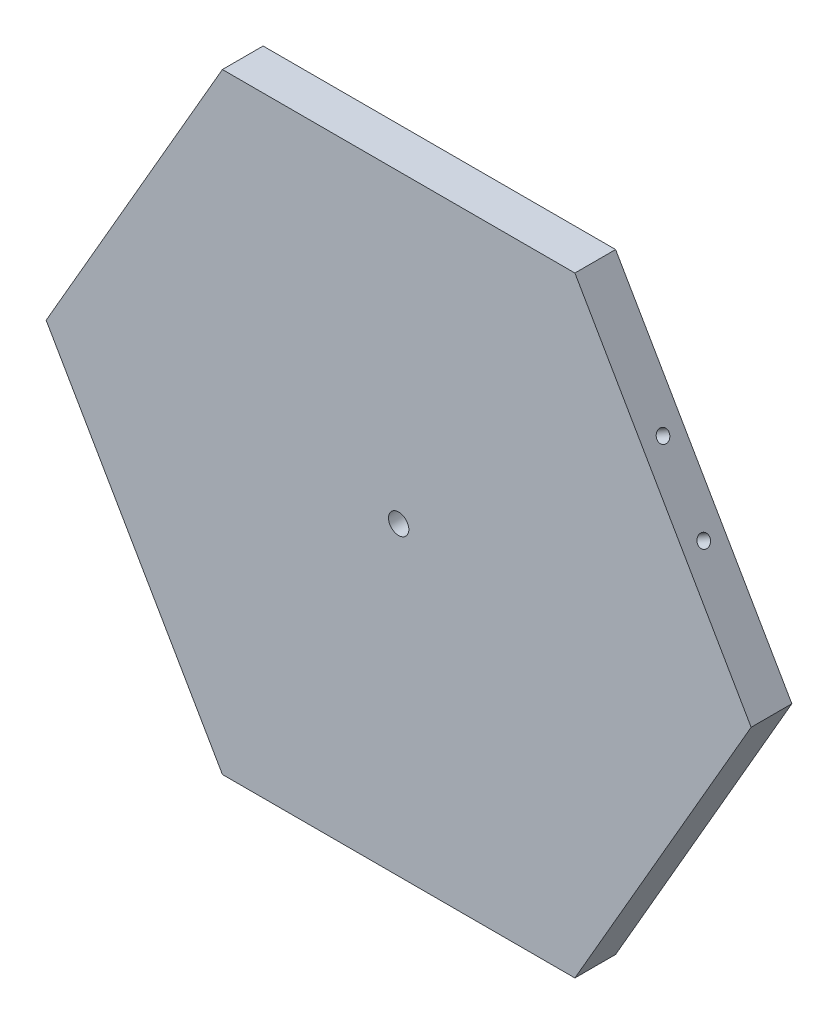
ISO-10303-21;
HEADER;
FILE_DESCRIPTION(('STEP AP214'),'2;1');
FILE_NAME('part.step','',(''),(''),'','','');
FILE_SCHEMA(('AUTOMOTIVE_DESIGN { 1 0 10303 214 1 1 1 1 }'));
ENDSEC;
DATA;
#1=APPLICATION_CONTEXT('core data for automotive mechanical design processes');
#2=APPLICATION_PROTOCOL_DEFINITION('international standard','automotive_design',2000,#1);
#3=PRODUCT_CONTEXT('',#1,'mechanical');
#4=PRODUCT('Part','Part','',(#3));
#5=PRODUCT_RELATED_PRODUCT_CATEGORY('part','',(#4));
#6=PRODUCT_DEFINITION_FORMATION('','',#4);
#7=PRODUCT_DEFINITION_CONTEXT('part definition',#1,'design');
#8=PRODUCT_DEFINITION('design','',#6,#7);
#9=PRODUCT_DEFINITION_SHAPE('','',#8);
#10=(LENGTH_UNIT() NAMED_UNIT(*) SI_UNIT(.MILLI.,.METRE.));
#11=(NAMED_UNIT(*) PLANE_ANGLE_UNIT() SI_UNIT($,.RADIAN.));
#12=(NAMED_UNIT(*) SI_UNIT($,.STERADIAN.) SOLID_ANGLE_UNIT());
#13=UNCERTAINTY_MEASURE_WITH_UNIT(LENGTH_MEASURE(1.E-05),#10,'distance_accuracy_value','');
#14=(GEOMETRIC_REPRESENTATION_CONTEXT(3) GLOBAL_UNCERTAINTY_ASSIGNED_CONTEXT((#13)) GLOBAL_UNIT_ASSIGNED_CONTEXT((#10,
#11,#12)) REPRESENTATION_CONTEXT('',''));
#15=CARTESIAN_POINT('',(0.,0.,0.));
#16=DIRECTION('',(0.,0.,1.));
#17=DIRECTION('',(1.,0.,0.));
#18=AXIS2_PLACEMENT_3D('',#15,#16,#17);
#19=CARTESIAN_POINT('',(43.3012701892219,-75.,5.));
#20=DIRECTION('',(-0.866025403784439,0.5,0.));
#21=DIRECTION('',(-0.5,-0.866025403784439,0.));
#22=AXIS2_PLACEMENT_3D('',#19,#20,#21);
#23=PLANE('',#22);
#24=DIRECTION('',(0.5,0.866025403784439,0.));
#25=VECTOR('',#24,1.);
#26=CARTESIAN_POINT('',(43.3012701892219,-75.,-5.));
#27=LINE('',#26,#25);
#28=CARTESIAN_POINT('',(43.3012701892219,-75.,-5.));
#29=VERTEX_POINT('',#28);
#30=CARTESIAN_POINT('',(86.6025403784438,0.,-5.));
#31=VERTEX_POINT('',#30);
#32=EDGE_CURVE('E138',#29,#31,#27,.T.);
#33=ORIENTED_EDGE('',*,*,#32,.T.);
#34=DIRECTION('',(0.,0.,-1.));
#35=VECTOR('',#34,1.);
#36=CARTESIAN_POINT('',(86.6025403784438,0.,5.));
#37=LINE('',#36,#35);
#38=CARTESIAN_POINT('',(86.6025403784438,0.,5.));
#39=VERTEX_POINT('',#38);
#40=EDGE_CURVE('E11',#39,#31,#37,.T.);
#41=ORIENTED_EDGE('',*,*,#40,.F.);
#42=DIRECTION('',(0.5,0.866025403784439,0.));
#43=VECTOR('',#42,1.);
#44=CARTESIAN_POINT('',(43.3012701892219,-75.,5.));
#45=LINE('',#44,#43);
#46=CARTESIAN_POINT('',(43.3012701892219,-75.,5.));
#47=VERTEX_POINT('',#46);
#48=EDGE_CURVE('E154',#47,#39,#45,.T.);
#49=ORIENTED_EDGE('',*,*,#48,.F.);
#50=DIRECTION('',(0.,0.,-1.));
#51=VECTOR('',#50,1.);
#52=CARTESIAN_POINT('',(43.3012701892219,-75.,5.));
#53=LINE('',#52,#51);
#54=EDGE_CURVE('E134',#47,#29,#53,.T.);
#55=ORIENTED_EDGE('',*,*,#54,.T.);
#56=EDGE_LOOP('',(#33,#41,#49,#55));
#57=FACE_BOUND('',#56,.T.);
#58=ADVANCED_FACE('F46',(#57),#23,.F.);
#59=CARTESIAN_POINT('',(86.6025403784438,0.,5.));
#60=DIRECTION('',(-0.866025403784439,-0.5,0.));
#61=DIRECTION('',(0.5,-0.866025403784439,0.));
#62=AXIS2_PLACEMENT_3D('',#59,#60,#61);
#63=PLANE('',#62);
#64=CARTESIAN_POINT('',(59.9519052838333,46.1602540378438,0.));
#65=DIRECTION('',(0.866025403784443,0.499999999999992,0.));
#66=DIRECTION('',(0.,0.,-1.));
#67=AXIS2_PLACEMENT_3D('',#64,#65,#66);
#68=CIRCLE('',#67,1.5);
#69=CARTESIAN_POINT('',(59.9519052838333,46.1602540378438,-1.5));
#70=VERTEX_POINT('',#69);
#71=EDGE_CURVE('E267',#70,#70,#68,.T.);
#72=ORIENTED_EDGE('',*,*,#71,.F.);
#73=EDGE_LOOP('',(#72));
#74=FACE_BOUND('',#73,.T.);
#75=CARTESIAN_POINT('',(69.9519052838332,28.839745962155,0.));
#76=DIRECTION('',(0.866025403784443,0.499999999999992,0.));
#77=DIRECTION('',(0.,0.,-1.));
#78=AXIS2_PLACEMENT_3D('',#75,#76,#77);
#79=CIRCLE('',#78,1.5);
#80=CARTESIAN_POINT('',(69.9519052838332,28.839745962155,-1.5));
#81=VERTEX_POINT('',#80);
#82=EDGE_CURVE('E266',#81,#81,#79,.T.);
#83=ORIENTED_EDGE('',*,*,#82,.F.);
#84=EDGE_LOOP('',(#83));
#85=FACE_BOUND('',#84,.T.);
#86=DIRECTION('',(-0.5,0.866025403784438,0.));
#87=VECTOR('',#86,1.);
#88=CARTESIAN_POINT('',(86.6025403784438,0.,-5.));
#89=LINE('',#88,#87);
#90=CARTESIAN_POINT('',(43.3012701892219,75.,-5.));
#91=VERTEX_POINT('',#90);
#92=EDGE_CURVE('E142',#31,#91,#89,.T.);
#93=ORIENTED_EDGE('',*,*,#92,.T.);
#94=DIRECTION('',(0.,0.,-1.));
#95=VECTOR('',#94,1.);
#96=CARTESIAN_POINT('',(43.3012701892219,75.,5.));
#97=LINE('',#96,#95);
#98=CARTESIAN_POINT('',(43.3012701892219,75.,5.));
#99=VERTEX_POINT('',#98);
#100=EDGE_CURVE('E55',#99,#91,#97,.T.);
#101=ORIENTED_EDGE('',*,*,#100,.F.);
#102=DIRECTION('',(-0.5,0.866025403784438,0.));
#103=VECTOR('',#102,1.);
#104=CARTESIAN_POINT('',(86.6025403784438,0.,5.));
#105=LINE('',#104,#103);
#106=EDGE_CURVE('E100',#39,#99,#105,.T.);
#107=ORIENTED_EDGE('',*,*,#106,.F.);
#108=ORIENTED_EDGE('',*,*,#40,.T.);
#109=EDGE_LOOP('',(#93,#101,#107,#108));
#110=FACE_BOUND('',#109,.T.);
#111=ADVANCED_FACE('F187',(#74,#85,#110),#63,.F.);
#112=CARTESIAN_POINT('',(43.3012701892219,75.,5.));
#113=DIRECTION('',(0.,-1.,0.));
#114=DIRECTION('',(0.,0.,-1.));
#115=AXIS2_PLACEMENT_3D('',#112,#113,#114);
#116=PLANE('',#115);
#117=DIRECTION('',(-1.,0.,0.));
#118=VECTOR('',#117,1.);
#119=CARTESIAN_POINT('',(43.3012701892219,75.,-5.));
#120=LINE('',#119,#118);
#121=CARTESIAN_POINT('',(-43.3012701892219,75.,-5.));
#122=VERTEX_POINT('',#121);
#123=EDGE_CURVE('E145',#91,#122,#120,.T.);
#124=ORIENTED_EDGE('',*,*,#123,.T.);
#125=DIRECTION('',(0.,0.,-1.));
#126=VECTOR('',#125,1.);
#127=CARTESIAN_POINT('',(-43.3012701892219,75.,5.));
#128=LINE('',#127,#126);
#129=CARTESIAN_POINT('',(-43.3012701892219,75.,5.));
#130=VERTEX_POINT('',#129);
#131=EDGE_CURVE('E124',#130,#122,#128,.T.);
#132=ORIENTED_EDGE('',*,*,#131,.F.);
#133=DIRECTION('',(-1.,0.,0.));
#134=VECTOR('',#133,1.);
#135=CARTESIAN_POINT('',(43.3012701892219,75.,5.));
#136=LINE('',#135,#134);
#137=EDGE_CURVE('E113',#99,#130,#136,.T.);
#138=ORIENTED_EDGE('',*,*,#137,.F.);
#139=ORIENTED_EDGE('',*,*,#100,.T.);
#140=EDGE_LOOP('',(#124,#132,#138,#139));
#141=FACE_BOUND('',#140,.T.);
#142=ADVANCED_FACE('F165',(#141),#116,.F.);
#143=CARTESIAN_POINT('',(-43.3012701892219,75.,5.));
#144=DIRECTION('',(0.866025403784439,-0.5,0.));
#145=DIRECTION('',(0.5,0.866025403784439,0.));
#146=AXIS2_PLACEMENT_3D('',#143,#144,#145);
#147=PLANE('',#146);
#148=CARTESIAN_POINT('',(-69.9519052838328,28.8397459621559,0.));
#149=DIRECTION('',(-0.866025403784436,0.500000000000004,0.));
#150=DIRECTION('',(0.,0.,-1.));
#151=AXIS2_PLACEMENT_3D('',#148,#149,#150);
#152=CIRCLE('',#151,1.5);
#153=CARTESIAN_POINT('',(-69.9519052838328,28.8397459621559,-1.5));
#154=VERTEX_POINT('',#153);
#155=EDGE_CURVE('E206',#154,#154,#152,.T.);
#156=ORIENTED_EDGE('',*,*,#155,.F.);
#157=EDGE_LOOP('',(#156));
#158=FACE_BOUND('',#157,.T.);
#159=CARTESIAN_POINT('',(-59.9519052838327,46.1602540378447,0.));
#160=DIRECTION('',(-0.866025403784436,0.500000000000004,0.));
#161=DIRECTION('',(0.,0.,-1.));
#162=AXIS2_PLACEMENT_3D('',#159,#160,#161);
#163=CIRCLE('',#162,1.5);
#164=CARTESIAN_POINT('',(-59.9519052838327,46.1602540378447,-1.5));
#165=VERTEX_POINT('',#164);
#166=EDGE_CURVE('E209',#165,#165,#163,.T.);
#167=ORIENTED_EDGE('',*,*,#166,.F.);
#168=EDGE_LOOP('',(#167));
#169=FACE_BOUND('',#168,.T.);
#170=DIRECTION('',(-0.5,-0.866025403784439,0.));
#171=VECTOR('',#170,1.);
#172=CARTESIAN_POINT('',(-43.3012701892219,75.,-5.));
#173=LINE('',#172,#171);
#174=CARTESIAN_POINT('',(-86.6025403784439,0.,-5.));
#175=VERTEX_POINT('',#174);
#176=EDGE_CURVE('E122',#122,#175,#173,.T.);
#177=ORIENTED_EDGE('',*,*,#176,.T.);
#178=DIRECTION('',(0.,0.,-1.));
#179=VECTOR('',#178,1.);
#180=CARTESIAN_POINT('',(-86.6025403784439,0.,5.));
#181=LINE('',#180,#179);
#182=CARTESIAN_POINT('',(-86.6025403784439,0.,5.));
#183=VERTEX_POINT('',#182);
#184=EDGE_CURVE('E119',#183,#175,#181,.T.);
#185=ORIENTED_EDGE('',*,*,#184,.F.);
#186=DIRECTION('',(-0.5,-0.866025403784439,0.));
#187=VECTOR('',#186,1.);
#188=CARTESIAN_POINT('',(-43.3012701892219,75.,5.));
#189=LINE('',#188,#187);
#190=EDGE_CURVE('E107',#130,#183,#189,.T.);
#191=ORIENTED_EDGE('',*,*,#190,.F.);
#192=ORIENTED_EDGE('',*,*,#131,.T.);
#193=EDGE_LOOP('',(#177,#185,#191,#192));
#194=FACE_BOUND('',#193,.T.);
#195=ADVANCED_FACE('F120',(#158,#169,#194),#147,.F.);
#196=CARTESIAN_POINT('',(-86.6025403784439,0.,5.));
#197=DIRECTION('',(0.866025403784439,0.5,0.));
#198=DIRECTION('',(-0.5,0.866025403784439,0.));
#199=AXIS2_PLACEMENT_3D('',#196,#197,#198);
#200=PLANE('',#199);
#201=DIRECTION('',(0.5,-0.866025403784439,0.));
#202=VECTOR('',#201,1.);
#203=CARTESIAN_POINT('',(-86.6025403784439,0.,-5.));
#204=LINE('',#203,#202);
#205=CARTESIAN_POINT('',(-43.3012701892219,-75.,-5.));
#206=VERTEX_POINT('',#205);
#207=EDGE_CURVE('E86',#175,#206,#204,.T.);
#208=ORIENTED_EDGE('',*,*,#207,.T.);
#209=DIRECTION('',(0.,0.,-1.));
#210=VECTOR('',#209,1.);
#211=CARTESIAN_POINT('',(-43.3012701892219,-75.,5.));
#212=LINE('',#211,#210);
#213=CARTESIAN_POINT('',(-43.3012701892219,-75.,5.));
#214=VERTEX_POINT('',#213);
#215=EDGE_CURVE('E125',#214,#206,#212,.T.);
#216=ORIENTED_EDGE('',*,*,#215,.F.);
#217=DIRECTION('',(0.5,-0.866025403784439,0.));
#218=VECTOR('',#217,1.);
#219=CARTESIAN_POINT('',(-86.6025403784439,0.,5.));
#220=LINE('',#219,#218);
#221=EDGE_CURVE('E111',#183,#214,#220,.T.);
#222=ORIENTED_EDGE('',*,*,#221,.F.);
#223=ORIENTED_EDGE('',*,*,#184,.T.);
#224=EDGE_LOOP('',(#208,#216,#222,#223));
#225=FACE_BOUND('',#224,.T.);
#226=ADVANCED_FACE('F127',(#225),#200,.F.);
#227=CARTESIAN_POINT('',(-43.3012701892219,-75.,5.));
#228=DIRECTION('',(0.,1.,0.));
#229=DIRECTION('',(0.,0.,1.));
#230=AXIS2_PLACEMENT_3D('',#227,#228,#229);
#231=PLANE('',#230);
#232=CARTESIAN_POINT('',(-10.,-75.,0.));
#233=DIRECTION('',(0.,-1.,0.));
#234=DIRECTION('',(0.,0.,-1.));
#235=AXIS2_PLACEMENT_3D('',#232,#233,#234);
#236=CIRCLE('',#235,1.5);
#237=CARTESIAN_POINT('',(-10.,-75.,-1.5));
#238=VERTEX_POINT('',#237);
#239=EDGE_CURVE('E237',#238,#238,#236,.T.);
#240=ORIENTED_EDGE('',*,*,#239,.F.);
#241=EDGE_LOOP('',(#240));
#242=FACE_BOUND('',#241,.T.);
#243=CARTESIAN_POINT('',(10.,-75.,0.));
#244=DIRECTION('',(0.,-1.,0.));
#245=DIRECTION('',(0.,0.,-1.));
#246=AXIS2_PLACEMENT_3D('',#243,#244,#245);
#247=CIRCLE('',#246,1.5);
#248=CARTESIAN_POINT('',(10.,-75.,-1.5));
#249=VERTEX_POINT('',#248);
#250=EDGE_CURVE('E241',#249,#249,#247,.T.);
#251=ORIENTED_EDGE('',*,*,#250,.F.);
#252=EDGE_LOOP('',(#251));
#253=FACE_BOUND('',#252,.T.);
#254=DIRECTION('',(1.,0.,0.));
#255=VECTOR('',#254,1.);
#256=CARTESIAN_POINT('',(-43.3012701892219,-75.,-5.));
#257=LINE('',#256,#255);
#258=EDGE_CURVE('E92',#206,#29,#257,.T.);
#259=ORIENTED_EDGE('',*,*,#258,.T.);
#260=ORIENTED_EDGE('',*,*,#54,.F.);
#261=DIRECTION('',(1.,0.,0.));
#262=VECTOR('',#261,1.);
#263=CARTESIAN_POINT('',(-43.3012701892219,-75.,5.));
#264=LINE('',#263,#262);
#265=EDGE_CURVE('E63',#214,#47,#264,.T.);
#266=ORIENTED_EDGE('',*,*,#265,.F.);
#267=ORIENTED_EDGE('',*,*,#215,.T.);
#268=EDGE_LOOP('',(#259,#260,#266,#267));
#269=FACE_BOUND('',#268,.T.);
#270=ADVANCED_FACE('F172',(#242,#253,#269),#231,.F.);
#271=CARTESIAN_POINT('',(0.,0.,5.));
#272=DIRECTION('',(0.,0.,1.));
#273=DIRECTION('',(1.,0.,0.));
#274=AXIS2_PLACEMENT_3D('',#271,#272,#273);
#275=PLANE('',#274);
#276=CARTESIAN_POINT('',(0.,0.,5.));
#277=DIRECTION('',(0.,0.,1.));
#278=DIRECTION('',(1.,0.,0.));
#279=AXIS2_PLACEMENT_3D('',#276,#277,#278);
#280=CIRCLE('',#279,2.5);
#281=CARTESIAN_POINT('',(2.5,0.,5.));
#282=VERTEX_POINT('',#281);
#283=EDGE_CURVE('E220',#282,#282,#280,.T.);
#284=ORIENTED_EDGE('',*,*,#283,.F.);
#285=EDGE_LOOP('',(#284));
#286=FACE_BOUND('',#285,.T.);
#287=ORIENTED_EDGE('',*,*,#48,.T.);
#288=ORIENTED_EDGE('',*,*,#106,.T.);
#289=ORIENTED_EDGE('',*,*,#137,.T.);
#290=ORIENTED_EDGE('',*,*,#190,.T.);
#291=ORIENTED_EDGE('',*,*,#221,.T.);
#292=ORIENTED_EDGE('',*,*,#265,.T.);
#293=EDGE_LOOP('',(#287,#288,#289,#290,#291,#292));
#294=FACE_BOUND('',#293,.T.);
#295=ADVANCED_FACE('F109',(#286,#294),#275,.T.);
#296=CARTESIAN_POINT('',(0.,0.,-5.));
#297=DIRECTION('',(0.,0.,1.));
#298=DIRECTION('',(1.,0.,0.));
#299=AXIS2_PLACEMENT_3D('',#296,#297,#298);
#300=PLANE('',#299);
#301=CARTESIAN_POINT('',(0.,0.,-5.));
#302=DIRECTION('',(0.,0.,1.));
#303=DIRECTION('',(1.,0.,0.));
#304=AXIS2_PLACEMENT_3D('',#301,#302,#303);
#305=CIRCLE('',#304,2.5);
#306=CARTESIAN_POINT('',(2.5,0.,-5.));
#307=VERTEX_POINT('',#306);
#308=EDGE_CURVE('E227',#307,#307,#305,.T.);
#309=ORIENTED_EDGE('',*,*,#308,.T.);
#310=EDGE_LOOP('',(#309));
#311=FACE_BOUND('',#310,.T.);
#312=ORIENTED_EDGE('',*,*,#32,.F.);
#313=ORIENTED_EDGE('',*,*,#258,.F.);
#314=ORIENTED_EDGE('',*,*,#207,.F.);
#315=ORIENTED_EDGE('',*,*,#176,.F.);
#316=ORIENTED_EDGE('',*,*,#123,.F.);
#317=ORIENTED_EDGE('',*,*,#92,.F.);
#318=EDGE_LOOP('',(#312,#313,#314,#315,#316,#317));
#319=FACE_BOUND('',#318,.T.);
#320=ADVANCED_FACE('F168',(#311,#319),#300,.F.);
#321=CARTESIAN_POINT('',(10.,-65.,0.));
#322=DIRECTION('',(0.,-1.,0.));
#323=DIRECTION('',(0.,0.,-1.));
#324=AXIS2_PLACEMENT_3D('',#321,#322,#323);
#325=CYLINDRICAL_SURFACE('',#324,1.5);
#326=CARTESIAN_POINT('',(10.,-65.,0.));
#327=DIRECTION('',(0.,-1.,0.));
#328=DIRECTION('',(0.,0.,-1.));
#329=AXIS2_PLACEMENT_3D('',#326,#327,#328);
#330=CIRCLE('',#329,1.5);
#331=CARTESIAN_POINT('',(10.,-65.,-1.5));
#332=VERTEX_POINT('',#331);
#333=EDGE_CURVE('E231',#332,#332,#330,.T.);
#334=ORIENTED_EDGE('',*,*,#333,.F.);
#335=EDGE_LOOP('',(#334));
#336=FACE_BOUND('',#335,.T.);
#337=ORIENTED_EDGE('',*,*,#250,.T.);
#338=EDGE_LOOP('',(#337));
#339=FACE_BOUND('',#338,.T.);
#340=ADVANCED_FACE('F336',(#336,#339),#325,.F.);
#341=CARTESIAN_POINT('',(10.,-65.,0.));
#342=DIRECTION('',(0.,-1.,0.));
#343=DIRECTION('',(0.,0.,-1.));
#344=AXIS2_PLACEMENT_3D('',#341,#342,#343);
#345=PLANE('',#344);
#346=ORIENTED_EDGE('',*,*,#333,.T.);
#347=EDGE_LOOP('',(#346));
#348=FACE_BOUND('',#347,.T.);
#349=ADVANCED_FACE('F334',(#348),#345,.T.);
#350=CARTESIAN_POINT('',(-10.,-65.,0.));
#351=DIRECTION('',(0.,-1.,0.));
#352=DIRECTION('',(0.,0.,-1.));
#353=AXIS2_PLACEMENT_3D('',#350,#351,#352);
#354=CYLINDRICAL_SURFACE('',#353,1.5);
#355=CARTESIAN_POINT('',(-10.,-65.,0.));
#356=DIRECTION('',(0.,-1.,0.));
#357=DIRECTION('',(0.,0.,-1.));
#358=AXIS2_PLACEMENT_3D('',#355,#356,#357);
#359=CIRCLE('',#358,1.5);
#360=CARTESIAN_POINT('',(-10.,-65.,-1.5));
#361=VERTEX_POINT('',#360);
#362=EDGE_CURVE('E143',#361,#361,#359,.T.);
#363=ORIENTED_EDGE('',*,*,#362,.F.);
#364=EDGE_LOOP('',(#363));
#365=FACE_BOUND('',#364,.T.);
#366=ORIENTED_EDGE('',*,*,#239,.T.);
#367=EDGE_LOOP('',(#366));
#368=FACE_BOUND('',#367,.T.);
#369=ADVANCED_FACE('F330',(#365,#368),#354,.F.);
#370=CARTESIAN_POINT('',(-10.,-65.,0.));
#371=DIRECTION('',(0.,-1.,0.));
#372=DIRECTION('',(0.,0.,-1.));
#373=AXIS2_PLACEMENT_3D('',#370,#371,#372);
#374=PLANE('',#373);
#375=ORIENTED_EDGE('',*,*,#362,.T.);
#376=EDGE_LOOP('',(#375));
#377=FACE_BOUND('',#376,.T.);
#378=ADVANCED_FACE('F326',(#377),#374,.T.);
#379=CARTESIAN_POINT('',(0.,0.,-5.));
#380=DIRECTION('',(0.,0.,1.));
#381=DIRECTION('',(1.,0.,0.));
#382=AXIS2_PLACEMENT_3D('',#379,#380,#381);
#383=CYLINDRICAL_SURFACE('',#382,2.5);
#384=ORIENTED_EDGE('',*,*,#308,.F.);
#385=EDGE_LOOP('',(#384));
#386=FACE_BOUND('',#385,.T.);
#387=ORIENTED_EDGE('',*,*,#283,.T.);
#388=EDGE_LOOP('',(#387));
#389=FACE_BOUND('',#388,.T.);
#390=ADVANCED_FACE('F322',(#386,#389),#383,.F.);
#391=CARTESIAN_POINT('',(-51.2916512459883,41.1602540378446,0.));
#392=DIRECTION('',(-0.866025403784436,0.500000000000004,0.));
#393=DIRECTION('',(-0.500000000000004,-0.866025403784436,0.));
#394=AXIS2_PLACEMENT_3D('',#391,#392,#393);
#395=CYLINDRICAL_SURFACE('',#394,1.5);
#396=CARTESIAN_POINT('',(-51.2916512459883,41.1602540378446,0.));
#397=DIRECTION('',(-0.866025403784436,0.500000000000004,0.));
#398=DIRECTION('',(0.,0.,-1.));
#399=AXIS2_PLACEMENT_3D('',#396,#397,#398);
#400=CIRCLE('',#399,1.5);
#401=CARTESIAN_POINT('',(-51.2916512459883,41.1602540378446,-1.5));
#402=VERTEX_POINT('',#401);
#403=EDGE_CURVE('E212',#402,#402,#400,.T.);
#404=ORIENTED_EDGE('',*,*,#403,.F.);
#405=EDGE_LOOP('',(#404));
#406=FACE_BOUND('',#405,.T.);
#407=ORIENTED_EDGE('',*,*,#166,.T.);
#408=EDGE_LOOP('',(#407));
#409=FACE_BOUND('',#408,.T.);
#410=ADVANCED_FACE('F318',(#406,#409),#395,.F.);
#411=CARTESIAN_POINT('',(-51.2916512459883,41.1602540378446,0.));
#412=DIRECTION('',(-0.866025403784436,0.500000000000004,0.));
#413=DIRECTION('',(0.,0.,-1.));
#414=AXIS2_PLACEMENT_3D('',#411,#412,#413);
#415=PLANE('',#414);
#416=ORIENTED_EDGE('',*,*,#403,.T.);
#417=EDGE_LOOP('',(#416));
#418=FACE_BOUND('',#417,.T.);
#419=ADVANCED_FACE('F314',(#418),#415,.T.);
#420=CARTESIAN_POINT('',(-61.2916512459884,23.8397459621559,0.));
#421=DIRECTION('',(-0.866025403784436,0.500000000000004,0.));
#422=DIRECTION('',(-0.500000000000004,-0.866025403784436,0.));
#423=AXIS2_PLACEMENT_3D('',#420,#421,#422);
#424=CYLINDRICAL_SURFACE('',#423,1.5);
#425=CARTESIAN_POINT('',(-61.2916512459884,23.8397459621559,0.));
#426=DIRECTION('',(-0.866025403784436,0.500000000000004,0.));
#427=DIRECTION('',(0.,0.,-1.));
#428=AXIS2_PLACEMENT_3D('',#425,#426,#427);
#429=CIRCLE('',#428,1.5);
#430=CARTESIAN_POINT('',(-61.2916512459884,23.8397459621559,-1.5));
#431=VERTEX_POINT('',#430);
#432=EDGE_CURVE('E213',#431,#431,#429,.T.);
#433=ORIENTED_EDGE('',*,*,#432,.F.);
#434=EDGE_LOOP('',(#433));
#435=FACE_BOUND('',#434,.T.);
#436=ORIENTED_EDGE('',*,*,#155,.T.);
#437=EDGE_LOOP('',(#436));
#438=FACE_BOUND('',#437,.T.);
#439=ADVANCED_FACE('F317',(#435,#438),#424,.F.);
#440=CARTESIAN_POINT('',(-61.2916512459884,23.8397459621559,0.));
#441=DIRECTION('',(-0.866025403784436,0.500000000000004,0.));
#442=DIRECTION('',(0.,0.,-1.));
#443=AXIS2_PLACEMENT_3D('',#440,#441,#442);
#444=PLANE('',#443);
#445=ORIENTED_EDGE('',*,*,#432,.T.);
#446=EDGE_LOOP('',(#445));
#447=FACE_BOUND('',#446,.T.);
#448=ADVANCED_FACE('F377',(#447),#444,.T.);
#449=CARTESIAN_POINT('',(61.2916512459887,23.839745962155,0.));
#450=DIRECTION('',(0.866025403784443,0.499999999999992,0.));
#451=DIRECTION('',(-0.499999999999992,0.866025403784443,0.));
#452=AXIS2_PLACEMENT_3D('',#449,#450,#451);
#453=CYLINDRICAL_SURFACE('',#452,1.5);
#454=CARTESIAN_POINT('',(61.2916512459887,23.839745962155,0.));
#455=DIRECTION('',(0.866025403784443,0.499999999999992,0.));
#456=DIRECTION('',(0.,0.,-1.));
#457=AXIS2_PLACEMENT_3D('',#454,#455,#456);
#458=CIRCLE('',#457,1.5);
#459=CARTESIAN_POINT('',(61.2916512459887,23.839745962155,-1.5));
#460=VERTEX_POINT('',#459);
#461=EDGE_CURVE('E286',#460,#460,#458,.T.);
#462=ORIENTED_EDGE('',*,*,#461,.F.);
#463=EDGE_LOOP('',(#462));
#464=FACE_BOUND('',#463,.T.);
#465=ORIENTED_EDGE('',*,*,#82,.T.);
#466=EDGE_LOOP('',(#465));
#467=FACE_BOUND('',#466,.T.);
#468=ADVANCED_FACE('F308',(#464,#467),#453,.F.);
#469=CARTESIAN_POINT('',(61.2916512459887,23.839745962155,0.));
#470=DIRECTION('',(0.866025403784443,0.499999999999992,0.));
#471=DIRECTION('',(0.,0.,-1.));
#472=AXIS2_PLACEMENT_3D('',#469,#470,#471);
#473=PLANE('',#472);
#474=ORIENTED_EDGE('',*,*,#461,.T.);
#475=EDGE_LOOP('',(#474));
#476=FACE_BOUND('',#475,.T.);
#477=ADVANCED_FACE('F299',(#476),#473,.T.);
#478=CARTESIAN_POINT('',(51.2916512459889,41.1602540378439,0.));
#479=DIRECTION('',(0.866025403784443,0.499999999999992,0.));
#480=DIRECTION('',(-0.499999999999992,0.866025403784443,0.));
#481=AXIS2_PLACEMENT_3D('',#478,#479,#480);
#482=CYLINDRICAL_SURFACE('',#481,1.5);
#483=CARTESIAN_POINT('',(51.2916512459889,41.1602540378439,0.));
#484=DIRECTION('',(0.866025403784443,0.499999999999992,0.));
#485=DIRECTION('',(0.,0.,-1.));
#486=AXIS2_PLACEMENT_3D('',#483,#484,#485);
#487=CIRCLE('',#486,1.5);
#488=CARTESIAN_POINT('',(51.2916512459889,41.1602540378439,-1.5));
#489=VERTEX_POINT('',#488);
#490=EDGE_CURVE('E263',#489,#489,#487,.T.);
#491=ORIENTED_EDGE('',*,*,#490,.F.);
#492=EDGE_LOOP('',(#491));
#493=FACE_BOUND('',#492,.T.);
#494=ORIENTED_EDGE('',*,*,#71,.T.);
#495=EDGE_LOOP('',(#494));
#496=FACE_BOUND('',#495,.T.);
#497=ADVANCED_FACE('F296',(#493,#496),#482,.F.);
#498=CARTESIAN_POINT('',(51.2916512459889,41.1602540378439,0.));
#499=DIRECTION('',(0.866025403784443,0.499999999999992,0.));
#500=DIRECTION('',(0.,0.,-1.));
#501=AXIS2_PLACEMENT_3D('',#498,#499,#500);
#502=PLANE('',#501);
#503=ORIENTED_EDGE('',*,*,#490,.T.);
#504=EDGE_LOOP('',(#503));
#505=FACE_BOUND('',#504,.T.);
#506=ADVANCED_FACE('F298',(#505),#502,.T.);
#507=CLOSED_SHELL('',(#58,#111,#142,#195,#226,#270,#295,#320,#340,#349,#369,#378,#390,#410,#419,
#439,#448,#468,#477,#497,#506));
#508=MANIFOLD_SOLID_BREP('B2',#507);
#509=ADVANCED_BREP_SHAPE_REPRESENTATION('',(#18,#508),#14);
#510=SHAPE_DEFINITION_REPRESENTATION(#9,#509);
ENDSEC;
END-ISO-10303-21;
